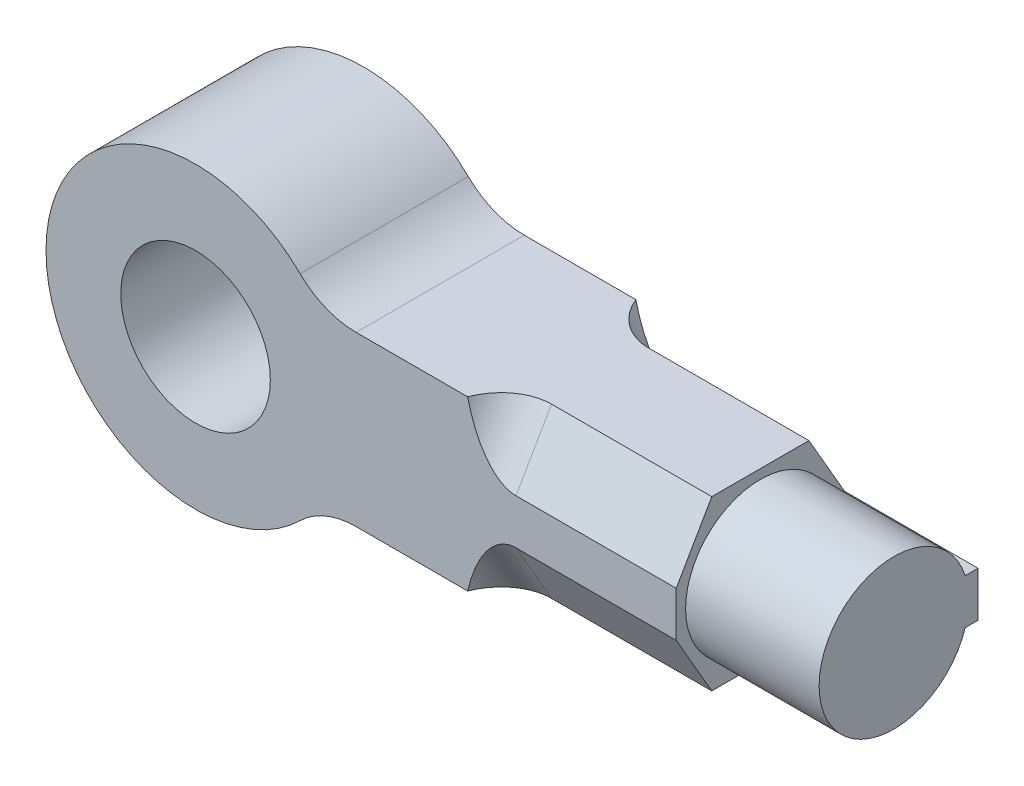
ISO-10303-21;
HEADER;
FILE_DESCRIPTION(('STEP AP214'),'2;1');
FILE_NAME('part.step','',(''),(''),'','','');
FILE_SCHEMA(('AUTOMOTIVE_DESIGN { 1 0 10303 214 1 1 1 1 }'));
ENDSEC;
DATA;
#1=APPLICATION_CONTEXT('core data for automotive mechanical design processes');
#2=APPLICATION_PROTOCOL_DEFINITION('international standard','automotive_design',2000,#1);
#3=PRODUCT_CONTEXT('',#1,'mechanical');
#4=PRODUCT('Part','Part','',(#3));
#5=PRODUCT_RELATED_PRODUCT_CATEGORY('part','',(#4));
#6=PRODUCT_DEFINITION_FORMATION('','',#4);
#7=PRODUCT_DEFINITION_CONTEXT('part definition',#1,'design');
#8=PRODUCT_DEFINITION('design','',#6,#7);
#9=PRODUCT_DEFINITION_SHAPE('','',#8);
#10=(LENGTH_UNIT() NAMED_UNIT(*) SI_UNIT(.MILLI.,.METRE.));
#11=(NAMED_UNIT(*) PLANE_ANGLE_UNIT() SI_UNIT($,.RADIAN.));
#12=(NAMED_UNIT(*) SI_UNIT($,.STERADIAN.) SOLID_ANGLE_UNIT());
#13=UNCERTAINTY_MEASURE_WITH_UNIT(LENGTH_MEASURE(1.E-05),#10,'distance_accuracy_value','');
#14=(GEOMETRIC_REPRESENTATION_CONTEXT(3) GLOBAL_UNCERTAINTY_ASSIGNED_CONTEXT((#13)) GLOBAL_UNIT_ASSIGNED_CONTEXT((#10,
#11,#12)) REPRESENTATION_CONTEXT('',''));
#15=CARTESIAN_POINT('',(0.,0.,0.));
#16=DIRECTION('',(0.,0.,1.));
#17=DIRECTION('',(1.,0.,0.));
#18=AXIS2_PLACEMENT_3D('',#15,#16,#17);
#19=CARTESIAN_POINT('',(180.,0.,0.));
#20=DIRECTION('',(1.,0.,0.));
#21=DIRECTION('',(0.,0.,-1.));
#22=AXIS2_PLACEMENT_3D('',#19,#20,#21);
#23=PLANE('',#22);
#24=CARTESIAN_POINT('',(180.,0.,0.));
#25=DIRECTION('',(1.,0.,0.));
#26=DIRECTION('',(0.,0.,-1.));
#27=AXIS2_PLACEMENT_3D('',#24,#25,#26);
#28=CIRCLE('',#27,28.);
#29=CARTESIAN_POINT('',(180.,8.44039956158089,-26.6975589753233));
#30=VERTEX_POINT('',#29);
#31=CARTESIAN_POINT('',(180.,-8.44039956158092,-26.6975589753233));
#32=VERTEX_POINT('',#31);
#33=EDGE_CURVE('E168',#30,#32,#28,.T.);
#34=ORIENTED_EDGE('',*,*,#33,.F.);
#35=DIRECTION('',(0.,0.,1.));
#36=VECTOR('',#35,1.);
#37=CARTESIAN_POINT('',(180.,8.44039956158089,-31.5));
#38=LINE('',#37,#36);
#39=CARTESIAN_POINT('',(180.,8.44039956158089,-31.5));
#40=VERTEX_POINT('',#39);
#41=EDGE_CURVE('E336',#40,#30,#38,.T.);
#42=ORIENTED_EDGE('',*,*,#41,.F.);
#43=DIRECTION('',(0.,0.866025403784439,0.5));
#44=VECTOR('',#43,1.);
#45=CARTESIAN_POINT('',(180.,0.,-36.3730669589467));
#46=LINE('',#45,#44);
#47=CARTESIAN_POINT('',(180.,31.5000000000003,-18.1865334794734));
#48=VERTEX_POINT('',#47);
#49=EDGE_CURVE('E269',#40,#48,#46,.T.);
#50=ORIENTED_EDGE('',*,*,#49,.T.);
#51=DIRECTION('',(0.,0.,1.));
#52=VECTOR('',#51,1.);
#53=CARTESIAN_POINT('',(180.,31.5,-31.5));
#54=LINE('',#53,#52);
#55=CARTESIAN_POINT('',(180.,31.5,18.1865334794735));
#56=VERTEX_POINT('',#55);
#57=EDGE_CURVE('E188',#48,#56,#54,.T.);
#58=ORIENTED_EDGE('',*,*,#57,.T.);
#59=DIRECTION('',(0.,-0.866025403784439,0.5));
#60=VECTOR('',#59,1.);
#61=CARTESIAN_POINT('',(180.,31.5000000000003,18.1865334794734));
#62=LINE('',#61,#60);
#63=CARTESIAN_POINT('',(180.,8.44039956158091,31.5));
#64=VERTEX_POINT('',#63);
#65=EDGE_CURVE('E293',#56,#64,#62,.T.);
#66=ORIENTED_EDGE('',*,*,#65,.T.);
#67=DIRECTION('',(0.,-1.,0.));
#68=VECTOR('',#67,1.);
#69=CARTESIAN_POINT('',(180.,-31.5,31.5));
#70=LINE('',#69,#68);
#71=CARTESIAN_POINT('',(180.,-8.44039956158091,31.5));
#72=VERTEX_POINT('',#71);
#73=EDGE_CURVE('E184',#64,#72,#70,.T.);
#74=ORIENTED_EDGE('',*,*,#73,.T.);
#75=DIRECTION('',(0.,-0.866025403784439,-0.5));
#76=VECTOR('',#75,1.);
#77=CARTESIAN_POINT('',(180.,0.,36.3730669589467));
#78=LINE('',#77,#76);
#79=CARTESIAN_POINT('',(180.,-31.5,18.1865334794735));
#80=VERTEX_POINT('',#79);
#81=EDGE_CURVE('E300',#72,#80,#78,.T.);
#82=ORIENTED_EDGE('',*,*,#81,.T.);
#83=DIRECTION('',(0.,0.,-1.));
#84=VECTOR('',#83,1.);
#85=CARTESIAN_POINT('',(180.,-31.5,-31.5));
#86=LINE('',#85,#84);
#87=CARTESIAN_POINT('',(180.,-31.5000000000003,-18.1865334794734));
#88=VERTEX_POINT('',#87);
#89=EDGE_CURVE('E189',#80,#88,#86,.T.);
#90=ORIENTED_EDGE('',*,*,#89,.T.);
#91=DIRECTION('',(0.,0.866025403784439,-0.5));
#92=VECTOR('',#91,1.);
#93=CARTESIAN_POINT('',(180.,-31.5000000000003,-18.1865334794734));
#94=LINE('',#93,#92);
#95=CARTESIAN_POINT('',(180.,-8.4403995615809,-31.5));
#96=VERTEX_POINT('',#95);
#97=EDGE_CURVE('E287',#88,#96,#94,.T.);
#98=ORIENTED_EDGE('',*,*,#97,.T.);
#99=DIRECTION('',(0.,0.,-1.));
#100=VECTOR('',#99,1.);
#101=CARTESIAN_POINT('',(180.,-8.4403995615809,-31.5));
#102=LINE('',#101,#100);
#103=EDGE_CURVE('E159',#32,#96,#102,.T.);
#104=ORIENTED_EDGE('',*,*,#103,.F.);
#105=EDGE_LOOP('',(#34,#42,#50,#58,#66,#74,#82,#90,#98,#104));
#106=FACE_BOUND('',#105,.T.);
#107=ADVANCED_FACE('F32',(#106),#23,.T.);
#108=CARTESIAN_POINT('',(230.,0.,0.));
#109=DIRECTION('',(-1.,0.,0.));
#110=DIRECTION('',(0.,0.,1.));
#111=AXIS2_PLACEMENT_3D('',#108,#109,#110);
#112=CYLINDRICAL_SURFACE('',#111,28.);
#113=DIRECTION('',(-1.,0.,0.));
#114=VECTOR('',#113,1.);
#115=CARTESIAN_POINT('',(247.550635852642,8.44039956158089,-26.6975589753233));
#116=LINE('',#115,#114);
#117=CARTESIAN_POINT('',(230.,8.44039956158088,-26.6975589753233));
#118=VERTEX_POINT('',#117);
#119=EDGE_CURVE('E169',#118,#30,#116,.T.);
#120=ORIENTED_EDGE('',*,*,#119,.T.);
#121=ORIENTED_EDGE('',*,*,#33,.T.);
#122=DIRECTION('',(-1.,0.,0.));
#123=VECTOR('',#122,1.);
#124=CARTESIAN_POINT('',(247.550635852642,-8.44039956158092,-26.6975589753233));
#125=LINE('',#124,#123);
#126=CARTESIAN_POINT('',(230.,-8.44039956158092,-26.6975589753233));
#127=VERTEX_POINT('',#126);
#128=EDGE_CURVE('E154',#127,#32,#125,.T.);
#129=ORIENTED_EDGE('',*,*,#128,.F.);
#130=CARTESIAN_POINT('',(230.,0.,0.));
#131=DIRECTION('',(1.,0.,0.));
#132=DIRECTION('',(0.,0.,-1.));
#133=AXIS2_PLACEMENT_3D('',#130,#131,#132);
#134=CIRCLE('',#133,28.);
#135=EDGE_CURVE('E166',#118,#127,#134,.T.);
#136=ORIENTED_EDGE('',*,*,#135,.F.);
#137=EDGE_LOOP('',(#120,#121,#129,#136));
#138=FACE_BOUND('',#137,.T.);
#139=ADVANCED_FACE('F165',(#138),#112,.T.);
#140=CARTESIAN_POINT('',(0.,0.,31.5));
#141=DIRECTION('',(0.,0.,1.));
#142=DIRECTION('',(1.,0.,0.));
#143=AXIS2_PLACEMENT_3D('',#140,#141,#142);
#144=PLANE('',#143);
#145=CARTESIAN_POINT('',(0.,0.,31.5));
#146=DIRECTION('',(0.,0.,1.));
#147=DIRECTION('',(1.,0.,0.));
#148=AXIS2_PLACEMENT_3D('',#145,#146,#147);
#149=CIRCLE('',#148,28.);
#150=CARTESIAN_POINT('',(28.,0.,31.5));
#151=VERTEX_POINT('',#150);
#152=EDGE_CURVE('E198',#151,#151,#149,.T.);
#153=ORIENTED_EDGE('',*,*,#152,.F.);
#154=EDGE_LOOP('',(#153));
#155=FACE_BOUND('',#154,.T.);
#156=DIRECTION('',(1.,0.,0.));
#157=VECTOR('',#156,1.);
#158=CARTESIAN_POINT('',(-56.002,-31.5,31.5));
#159=LINE('',#158,#157);
#160=CARTESIAN_POINT('',(60.1144741306118,-31.5,31.5));
#161=VERTEX_POINT('',#160);
#162=CARTESIAN_POINT('',(101.882171331158,-31.5,31.5));
#163=VERTEX_POINT('',#162);
#164=EDGE_CURVE('E172',#161,#163,#159,.T.);
#165=ORIENTED_EDGE('',*,*,#164,.T.);
#166=CARTESIAN_POINT('',(120.,-48.4403995615809,31.5));
#167=DIRECTION('',(0.,0.,1.));
#168=DIRECTION('',(0.,1.,0.));
#169=AXIS2_PLACEMENT_3D('',#166,#167,#168);
#170=ELLIPSE('',#169,40.,20.);
#171=CARTESIAN_POINT('',(120.,-8.44039956158091,31.5));
#172=VERTEX_POINT('',#171);
#173=EDGE_CURVE('E245',#163,#172,#170,.F.);
#174=ORIENTED_EDGE('',*,*,#173,.T.);
#175=DIRECTION('',(1.,0.,0.));
#176=VECTOR('',#175,1.);
#177=CARTESIAN_POINT('',(0.,-8.44039956158091,31.5));
#178=LINE('',#177,#176);
#179=EDGE_CURVE('E173',#172,#72,#178,.T.);
#180=ORIENTED_EDGE('',*,*,#179,.T.);
#181=ORIENTED_EDGE('',*,*,#73,.F.);
#182=DIRECTION('',(-1.,0.,0.));
#183=VECTOR('',#182,1.);
#184=CARTESIAN_POINT('',(0.,8.44039956158091,31.5));
#185=LINE('',#184,#183);
#186=CARTESIAN_POINT('',(120.,8.44039956158091,31.5));
#187=VERTEX_POINT('',#186);
#188=EDGE_CURVE('E270',#64,#187,#185,.T.);
#189=ORIENTED_EDGE('',*,*,#188,.T.);
#190=CARTESIAN_POINT('',(120.,48.4403995615809,31.5));
#191=DIRECTION('',(0.,0.,1.));
#192=DIRECTION('',(0.,1.,0.));
#193=AXIS2_PLACEMENT_3D('',#190,#191,#192);
#194=ELLIPSE('',#193,40.,20.);
#195=CARTESIAN_POINT('',(101.882171331158,31.5,31.5));
#196=VERTEX_POINT('',#195);
#197=EDGE_CURVE('E237',#187,#196,#194,.F.);
#198=ORIENTED_EDGE('',*,*,#197,.T.);
#199=DIRECTION('',(1.,0.,0.));
#200=VECTOR('',#199,1.);
#201=CARTESIAN_POINT('',(-56.002,31.5,31.5));
#202=LINE('',#201,#200);
#203=CARTESIAN_POINT('',(60.1144741306118,31.5,31.5));
#204=VERTEX_POINT('',#203);
#205=EDGE_CURVE('E192',#204,#196,#202,.T.);
#206=ORIENTED_EDGE('',*,*,#205,.F.);
#207=CARTESIAN_POINT('',(60.1144741306118,61.5,31.5));
#208=DIRECTION('',(0.,0.,1.));
#209=DIRECTION('',(1.,0.,0.));
#210=AXIS2_PLACEMENT_3D('',#207,#208,#209);
#211=CIRCLE('',#210,30.);
#212=CARTESIAN_POINT('',(39.1443087362124,40.046511627907,31.5));
#213=VERTEX_POINT('',#212);
#214=EDGE_CURVE('E223',#204,#213,#211,.F.);
#215=ORIENTED_EDGE('',*,*,#214,.T.);
#216=CARTESIAN_POINT('',(0.,0.,31.5));
#217=DIRECTION('',(0.,0.,1.));
#218=DIRECTION('',(1.,0.,0.));
#219=AXIS2_PLACEMENT_3D('',#216,#217,#218);
#220=CIRCLE('',#219,56.);
#221=CARTESIAN_POINT('',(39.1443087362124,-40.046511627907,31.5));
#222=VERTEX_POINT('',#221);
#223=EDGE_CURVE('E204',#213,#222,#220,.T.);
#224=ORIENTED_EDGE('',*,*,#223,.T.);
#225=CARTESIAN_POINT('',(60.1144741306118,-61.5,31.5));
#226=DIRECTION('',(0.,0.,1.));
#227=DIRECTION('',(1.,0.,0.));
#228=AXIS2_PLACEMENT_3D('',#225,#226,#227);
#229=CIRCLE('',#228,30.);
#230=EDGE_CURVE('E221',#222,#161,#229,.F.);
#231=ORIENTED_EDGE('',*,*,#230,.T.);
#232=EDGE_LOOP('',(#165,#174,#180,#181,#189,#198,#206,#215,#224,#231));
#233=FACE_BOUND('',#232,.T.);
#234=ADVANCED_FACE('F321',(#155,#233),#144,.T.);
#235=CARTESIAN_POINT('',(0.,0.,-31.5));
#236=DIRECTION('',(0.,0.,1.));
#237=DIRECTION('',(1.,0.,0.));
#238=AXIS2_PLACEMENT_3D('',#235,#236,#237);
#239=PLANE('',#238);
#240=CARTESIAN_POINT('',(0.,0.,-31.5));
#241=DIRECTION('',(0.,0.,1.));
#242=DIRECTION('',(1.,0.,0.));
#243=AXIS2_PLACEMENT_3D('',#240,#241,#242);
#244=CIRCLE('',#243,28.);
#245=CARTESIAN_POINT('',(28.,0.,-31.5));
#246=VERTEX_POINT('',#245);
#247=EDGE_CURVE('E187',#246,#246,#244,.T.);
#248=ORIENTED_EDGE('',*,*,#247,.T.);
#249=EDGE_LOOP('',(#248));
#250=FACE_BOUND('',#249,.T.);
#251=DIRECTION('',(1.,0.,0.));
#252=VECTOR('',#251,1.);
#253=CARTESIAN_POINT('',(-56.002,31.5,-31.5));
#254=LINE('',#253,#252);
#255=CARTESIAN_POINT('',(60.1144741306118,31.5,-31.5));
#256=VERTEX_POINT('',#255);
#257=CARTESIAN_POINT('',(101.882171331158,31.5,-31.5));
#258=VERTEX_POINT('',#257);
#259=EDGE_CURVE('E54',#256,#258,#254,.T.);
#260=ORIENTED_EDGE('',*,*,#259,.T.);
#261=CARTESIAN_POINT('',(120.,48.4403995615809,-31.5));
#262=DIRECTION('',(0.,0.,1.));
#263=DIRECTION('',(0.,-1.,0.));
#264=AXIS2_PLACEMENT_3D('',#261,#262,#263);
#265=ELLIPSE('',#264,40.,20.);
#266=CARTESIAN_POINT('',(120.,8.4403995615809,-31.5));
#267=VERTEX_POINT('',#266);
#268=EDGE_CURVE('E11',#258,#267,#265,.T.);
#269=ORIENTED_EDGE('',*,*,#268,.T.);
#270=DIRECTION('',(-1.,0.,0.));
#271=VECTOR('',#270,1.);
#272=CARTESIAN_POINT('',(0.,8.4403995615809,-31.5));
#273=LINE('',#272,#271);
#274=EDGE_CURVE('E264',#40,#267,#273,.T.);
#275=ORIENTED_EDGE('',*,*,#274,.F.);
#276=DIRECTION('',(-1.,0.,0.));
#277=VECTOR('',#276,1.);
#278=CARTESIAN_POINT('',(247.550635852642,8.44039956158089,-31.5));
#279=LINE('',#278,#277);
#280=CARTESIAN_POINT('',(230.,8.44039956158089,-31.5));
#281=VERTEX_POINT('',#280);
#282=EDGE_CURVE('E338',#281,#40,#279,.T.);
#283=ORIENTED_EDGE('',*,*,#282,.F.);
#284=DIRECTION('',(0.,1.,0.));
#285=VECTOR('',#284,1.);
#286=CARTESIAN_POINT('',(230.,8.44039956158089,-31.5));
#287=LINE('',#286,#285);
#288=CARTESIAN_POINT('',(230.,-8.4403995615809,-31.5));
#289=VERTEX_POINT('',#288);
#290=EDGE_CURVE('E158',#289,#281,#287,.T.);
#291=ORIENTED_EDGE('',*,*,#290,.F.);
#292=DIRECTION('',(-1.,0.,0.));
#293=VECTOR('',#292,1.);
#294=CARTESIAN_POINT('',(247.550635852642,-8.4403995615809,-31.5));
#295=LINE('',#294,#293);
#296=EDGE_CURVE('E156',#289,#96,#295,.T.);
#297=ORIENTED_EDGE('',*,*,#296,.T.);
#298=DIRECTION('',(1.,0.,0.));
#299=VECTOR('',#298,1.);
#300=CARTESIAN_POINT('',(0.,-8.4403995615809,-31.5));
#301=LINE('',#300,#299);
#302=CARTESIAN_POINT('',(120.,-8.4403995615809,-31.5));
#303=VERTEX_POINT('',#302);
#304=EDGE_CURVE('E177',#303,#96,#301,.T.);
#305=ORIENTED_EDGE('',*,*,#304,.F.);
#306=CARTESIAN_POINT('',(120.,-48.4403995615809,-31.5));
#307=DIRECTION('',(0.,0.,1.));
#308=DIRECTION('',(0.,-1.,0.));
#309=AXIS2_PLACEMENT_3D('',#306,#307,#308);
#310=ELLIPSE('',#309,40.,20.);
#311=CARTESIAN_POINT('',(101.882171331158,-31.5,-31.5));
#312=VERTEX_POINT('',#311);
#313=EDGE_CURVE('E247',#303,#312,#310,.T.);
#314=ORIENTED_EDGE('',*,*,#313,.T.);
#315=DIRECTION('',(1.,0.,0.));
#316=VECTOR('',#315,1.);
#317=CARTESIAN_POINT('',(-56.002,-31.5,-31.5));
#318=LINE('',#317,#316);
#319=CARTESIAN_POINT('',(60.1144741306118,-31.5,-31.5));
#320=VERTEX_POINT('',#319);
#321=EDGE_CURVE('E175',#320,#312,#318,.T.);
#322=ORIENTED_EDGE('',*,*,#321,.F.);
#323=CARTESIAN_POINT('',(60.1144741306118,-61.5,-31.5));
#324=DIRECTION('',(0.,0.,1.));
#325=DIRECTION('',(1.,0.,0.));
#326=AXIS2_PLACEMENT_3D('',#323,#324,#325);
#327=CIRCLE('',#326,30.);
#328=CARTESIAN_POINT('',(39.1443087362124,-40.046511627907,-31.5));
#329=VERTEX_POINT('',#328);
#330=EDGE_CURVE('E219',#320,#329,#327,.T.);
#331=ORIENTED_EDGE('',*,*,#330,.T.);
#332=CARTESIAN_POINT('',(0.,0.,-31.5));
#333=DIRECTION('',(0.,0.,1.));
#334=DIRECTION('',(1.,0.,0.));
#335=AXIS2_PLACEMENT_3D('',#332,#333,#334);
#336=CIRCLE('',#335,56.);
#337=CARTESIAN_POINT('',(39.1443087362124,40.046511627907,-31.5));
#338=VERTEX_POINT('',#337);
#339=EDGE_CURVE('E201',#338,#329,#336,.T.);
#340=ORIENTED_EDGE('',*,*,#339,.F.);
#341=CARTESIAN_POINT('',(60.1144741306118,61.5,-31.5));
#342=DIRECTION('',(0.,0.,1.));
#343=DIRECTION('',(1.,0.,0.));
#344=AXIS2_PLACEMENT_3D('',#341,#342,#343);
#345=CIRCLE('',#344,30.);
#346=EDGE_CURVE('E183',#338,#256,#345,.T.);
#347=ORIENTED_EDGE('',*,*,#346,.T.);
#348=EDGE_LOOP('',(#260,#269,#275,#283,#291,#297,#305,#314,#322,#331,#340,#347));
#349=FACE_BOUND('',#348,.T.);
#350=ADVANCED_FACE('F262',(#250,#349),#239,.F.);
#351=CARTESIAN_POINT('',(-56.002,-31.5,-31.5));
#352=DIRECTION('',(0.,-1.,0.));
#353=DIRECTION('',(0.,0.,-1.));
#354=AXIS2_PLACEMENT_3D('',#351,#352,#353);
#355=PLANE('',#354);
#356=ORIENTED_EDGE('',*,*,#89,.F.);
#357=DIRECTION('',(1.,0.,0.));
#358=VECTOR('',#357,1.);
#359=CARTESIAN_POINT('',(100.,-31.5000000000003,18.1865334794734));
#360=LINE('',#359,#358);
#361=CARTESIAN_POINT('',(120.,-31.5000000000003,18.1865334794734));
#362=VERTEX_POINT('',#361);
#363=EDGE_CURVE('E271',#362,#80,#360,.T.);
#364=ORIENTED_EDGE('',*,*,#363,.F.);
#365=CARTESIAN_POINT('',(120.,-31.5,41.2805442470586));
#366=DIRECTION('',(0.,-1.,0.));
#367=DIRECTION('',(0.,0.,1.));
#368=AXIS2_PLACEMENT_3D('',#365,#366,#367);
#369=ELLIPSE('',#368,23.094010767585,20.);
#370=EDGE_CURVE('E242',#362,#163,#369,.F.);
#371=ORIENTED_EDGE('',*,*,#370,.T.);
#372=ORIENTED_EDGE('',*,*,#164,.F.);
#373=DIRECTION('',(0.,0.,-1.));
#374=VECTOR('',#373,1.);
#375=CARTESIAN_POINT('',(60.1144741306118,-31.5,-31.5));
#376=LINE('',#375,#374);
#377=EDGE_CURVE('E207',#161,#320,#376,.T.);
#378=ORIENTED_EDGE('',*,*,#377,.T.);
#379=ORIENTED_EDGE('',*,*,#321,.T.);
#380=CARTESIAN_POINT('',(120.,-31.5,-41.2805442470585));
#381=DIRECTION('',(0.,-1.,0.));
#382=DIRECTION('',(0.,0.,1.));
#383=AXIS2_PLACEMENT_3D('',#380,#381,#382);
#384=ELLIPSE('',#383,23.094010767585,20.);
#385=CARTESIAN_POINT('',(120.,-31.5000000000003,-18.1865334794734));
#386=VERTEX_POINT('',#385);
#387=EDGE_CURVE('E250',#312,#386,#384,.F.);
#388=ORIENTED_EDGE('',*,*,#387,.T.);
#389=DIRECTION('',(1.,0.,0.));
#390=VECTOR('',#389,1.);
#391=CARTESIAN_POINT('',(100.,-31.5000000000003,-18.1865334794734));
#392=LINE('',#391,#390);
#393=EDGE_CURVE('E278',#386,#88,#392,.T.);
#394=ORIENTED_EDGE('',*,*,#393,.T.);
#395=EDGE_LOOP('',(#356,#364,#371,#372,#378,#379,#388,#394));
#396=FACE_BOUND('',#395,.T.);
#397=ADVANCED_FACE('F303',(#396),#355,.T.);
#398=CARTESIAN_POINT('',(-56.002,31.5,-31.5));
#399=DIRECTION('',(0.,1.,0.));
#400=DIRECTION('',(0.,0.,1.));
#401=AXIS2_PLACEMENT_3D('',#398,#399,#400);
#402=PLANE('',#401);
#403=DIRECTION('',(1.,0.,0.));
#404=VECTOR('',#403,1.);
#405=CARTESIAN_POINT('',(100.,31.5000000000003,-18.1865334794734));
#406=LINE('',#405,#404);
#407=CARTESIAN_POINT('',(120.,31.5000000000003,-18.1865334794734));
#408=VERTEX_POINT('',#407);
#409=EDGE_CURVE('E257',#408,#48,#406,.T.);
#410=ORIENTED_EDGE('',*,*,#409,.F.);
#411=CARTESIAN_POINT('',(120.,31.5,-41.2805442470586));
#412=DIRECTION('',(0.,1.,0.));
#413=DIRECTION('',(0.,0.,-1.));
#414=AXIS2_PLACEMENT_3D('',#411,#412,#413);
#415=ELLIPSE('',#414,23.094010767585,20.);
#416=EDGE_CURVE('E40',#408,#258,#415,.F.);
#417=ORIENTED_EDGE('',*,*,#416,.T.);
#418=ORIENTED_EDGE('',*,*,#259,.F.);
#419=DIRECTION('',(0.,0.,-1.));
#420=VECTOR('',#419,1.);
#421=CARTESIAN_POINT('',(60.1144741306118,31.5,-31.5));
#422=LINE('',#421,#420);
#423=EDGE_CURVE('E216',#256,#204,#422,.F.);
#424=ORIENTED_EDGE('',*,*,#423,.T.);
#425=ORIENTED_EDGE('',*,*,#205,.T.);
#426=CARTESIAN_POINT('',(120.,31.5,41.2805442470586));
#427=DIRECTION('',(0.,1.,0.));
#428=DIRECTION('',(0.,0.,-1.));
#429=AXIS2_PLACEMENT_3D('',#426,#427,#428);
#430=ELLIPSE('',#429,23.094010767585,20.);
#431=CARTESIAN_POINT('',(120.,31.5000000000003,18.1865334794734));
#432=VERTEX_POINT('',#431);
#433=EDGE_CURVE('E240',#196,#432,#430,.F.);
#434=ORIENTED_EDGE('',*,*,#433,.T.);
#435=DIRECTION('',(1.,0.,0.));
#436=VECTOR('',#435,1.);
#437=CARTESIAN_POINT('',(100.,31.5000000000003,18.1865334794734));
#438=LINE('',#437,#436);
#439=EDGE_CURVE('E275',#432,#56,#438,.T.);
#440=ORIENTED_EDGE('',*,*,#439,.T.);
#441=ORIENTED_EDGE('',*,*,#57,.F.);
#442=EDGE_LOOP('',(#410,#417,#418,#424,#425,#434,#440,#441));
#443=FACE_BOUND('',#442,.T.);
#444=ADVANCED_FACE('F254',(#443),#402,.T.);
#445=CARTESIAN_POINT('',(0.,0.,31.5));
#446=DIRECTION('',(0.,0.,-1.));
#447=DIRECTION('',(-1.,0.,0.));
#448=AXIS2_PLACEMENT_3D('',#445,#446,#447);
#449=CYLINDRICAL_SURFACE('',#448,56.);
#450=ORIENTED_EDGE('',*,*,#339,.T.);
#451=DIRECTION('',(0.,0.,-1.));
#452=VECTOR('',#451,1.);
#453=CARTESIAN_POINT('',(39.1443087362124,-40.046511627907,31.5));
#454=LINE('',#453,#452);
#455=EDGE_CURVE('E214',#329,#222,#454,.F.);
#456=ORIENTED_EDGE('',*,*,#455,.T.);
#457=ORIENTED_EDGE('',*,*,#223,.F.);
#458=DIRECTION('',(0.,0.,-1.));
#459=VECTOR('',#458,1.);
#460=CARTESIAN_POINT('',(39.1443087362124,40.046511627907,31.5));
#461=LINE('',#460,#459);
#462=EDGE_CURVE('E212',#213,#338,#461,.T.);
#463=ORIENTED_EDGE('',*,*,#462,.T.);
#464=EDGE_LOOP('',(#450,#456,#457,#463));
#465=FACE_BOUND('',#464,.T.);
#466=ADVANCED_FACE('F318',(#465),#449,.T.);
#467=CARTESIAN_POINT('',(0.,0.,31.5));
#468=DIRECTION('',(0.,0.,-1.));
#469=DIRECTION('',(-1.,0.,0.));
#470=AXIS2_PLACEMENT_3D('',#467,#468,#469);
#471=CYLINDRICAL_SURFACE('',#470,28.);
#472=ORIENTED_EDGE('',*,*,#152,.T.);
#473=EDGE_LOOP('',(#472));
#474=FACE_BOUND('',#473,.T.);
#475=ORIENTED_EDGE('',*,*,#247,.F.);
#476=EDGE_LOOP('',(#475));
#477=FACE_BOUND('',#476,.T.);
#478=ADVANCED_FACE('F365',(#474,#477),#471,.F.);
#479=CARTESIAN_POINT('',(60.1144741306118,-61.5,31.5));
#480=DIRECTION('',(0.,0.,-1.));
#481=DIRECTION('',(-1.,0.,0.));
#482=AXIS2_PLACEMENT_3D('',#479,#480,#481);
#483=CYLINDRICAL_SURFACE('',#482,30.);
#484=ORIENTED_EDGE('',*,*,#230,.F.);
#485=ORIENTED_EDGE('',*,*,#455,.F.);
#486=ORIENTED_EDGE('',*,*,#330,.F.);
#487=ORIENTED_EDGE('',*,*,#377,.F.);
#488=EDGE_LOOP('',(#484,#485,#486,#487));
#489=FACE_BOUND('',#488,.T.);
#490=ADVANCED_FACE('F314',(#489),#483,.F.);
#491=CARTESIAN_POINT('',(60.1144741306118,61.5,31.5));
#492=DIRECTION('',(0.,0.,-1.));
#493=DIRECTION('',(-1.,0.,0.));
#494=AXIS2_PLACEMENT_3D('',#491,#492,#493);
#495=CYLINDRICAL_SURFACE('',#494,30.);
#496=ORIENTED_EDGE('',*,*,#346,.F.);
#497=ORIENTED_EDGE('',*,*,#462,.F.);
#498=ORIENTED_EDGE('',*,*,#214,.F.);
#499=ORIENTED_EDGE('',*,*,#423,.F.);
#500=EDGE_LOOP('',(#496,#497,#498,#499));
#501=FACE_BOUND('',#500,.T.);
#502=ADVANCED_FACE('F325',(#501),#495,.F.);
#503=CARTESIAN_POINT('',(230.,0.,0.));
#504=DIRECTION('',(1.,0.,0.));
#505=DIRECTION('',(0.,0.,-1.));
#506=AXIS2_PLACEMENT_3D('',#503,#504,#505);
#507=PLANE('',#506);
#508=ORIENTED_EDGE('',*,*,#135,.T.);
#509=DIRECTION('',(0.,0.,-1.));
#510=VECTOR('',#509,1.);
#511=CARTESIAN_POINT('',(230.,-8.4403995615809,-31.5));
#512=LINE('',#511,#510);
#513=EDGE_CURVE('E150',#127,#289,#512,.T.);
#514=ORIENTED_EDGE('',*,*,#513,.T.);
#515=ORIENTED_EDGE('',*,*,#290,.T.);
#516=DIRECTION('',(0.,0.,1.));
#517=VECTOR('',#516,1.);
#518=CARTESIAN_POINT('',(230.,8.44039956158089,-31.5));
#519=LINE('',#518,#517);
#520=EDGE_CURVE('E47',#281,#118,#519,.T.);
#521=ORIENTED_EDGE('',*,*,#520,.T.);
#522=EDGE_LOOP('',(#508,#514,#515,#521));
#523=FACE_BOUND('',#522,.T.);
#524=ADVANCED_FACE('F171',(#523),#507,.T.);
#525=CARTESIAN_POINT('',(100.,0.,-36.3730669589467));
#526=DIRECTION('',(0.,0.5,-0.866025403784439));
#527=DIRECTION('',(0.,0.866025403784439,0.5));
#528=AXIS2_PLACEMENT_3D('',#525,#526,#527);
#529=PLANE('',#528);
#530=ORIENTED_EDGE('',*,*,#274,.T.);
#531=DIRECTION('',(0.,0.866025403784439,0.5));
#532=VECTOR('',#531,1.);
#533=CARTESIAN_POINT('',(120.,31.5,-18.1865334794735));
#534=LINE('',#533,#532);
#535=EDGE_CURVE('E234',#267,#408,#534,.T.);
#536=ORIENTED_EDGE('',*,*,#535,.T.);
#537=ORIENTED_EDGE('',*,*,#409,.T.);
#538=ORIENTED_EDGE('',*,*,#49,.F.);
#539=EDGE_LOOP('',(#530,#536,#537,#538));
#540=FACE_BOUND('',#539,.T.);
#541=ADVANCED_FACE('F267',(#540),#529,.T.);
#542=CARTESIAN_POINT('',(100.,31.5000000000003,18.1865334794734));
#543=DIRECTION('',(0.,0.5,0.866025403784439));
#544=DIRECTION('',(0.,-0.866025403784439,0.5));
#545=AXIS2_PLACEMENT_3D('',#542,#543,#544);
#546=PLANE('',#545);
#547=ORIENTED_EDGE('',*,*,#439,.F.);
#548=DIRECTION('',(0.,-0.866025403784439,0.5));
#549=VECTOR('',#548,1.);
#550=CARTESIAN_POINT('',(120.,8.44039956158091,31.5));
#551=LINE('',#550,#549);
#552=EDGE_CURVE('E182',#432,#187,#551,.T.);
#553=ORIENTED_EDGE('',*,*,#552,.T.);
#554=ORIENTED_EDGE('',*,*,#188,.F.);
#555=ORIENTED_EDGE('',*,*,#65,.F.);
#556=EDGE_LOOP('',(#547,#553,#554,#555));
#557=FACE_BOUND('',#556,.T.);
#558=ADVANCED_FACE('F333',(#557),#546,.T.);
#559=CARTESIAN_POINT('',(100.,-31.5000000000003,-18.1865334794734));
#560=DIRECTION('',(0.,-0.5,-0.866025403784439));
#561=DIRECTION('',(0.,0.866025403784439,-0.5));
#562=AXIS2_PLACEMENT_3D('',#559,#560,#561);
#563=PLANE('',#562);
#564=ORIENTED_EDGE('',*,*,#393,.F.);
#565=DIRECTION('',(0.,0.866025403784439,-0.5));
#566=VECTOR('',#565,1.);
#567=CARTESIAN_POINT('',(120.,-8.44039956158089,-31.5));
#568=LINE('',#567,#566);
#569=EDGE_CURVE('E231',#386,#303,#568,.T.);
#570=ORIENTED_EDGE('',*,*,#569,.T.);
#571=ORIENTED_EDGE('',*,*,#304,.T.);
#572=ORIENTED_EDGE('',*,*,#97,.F.);
#573=EDGE_LOOP('',(#564,#570,#571,#572));
#574=FACE_BOUND('',#573,.T.);
#575=ADVANCED_FACE('F286',(#574),#563,.T.);
#576=CARTESIAN_POINT('',(100.,0.,36.3730669589467));
#577=DIRECTION('',(0.,-0.5,0.866025403784439));
#578=DIRECTION('',(0.,-0.866025403784439,-0.5));
#579=AXIS2_PLACEMENT_3D('',#576,#577,#578);
#580=PLANE('',#579);
#581=ORIENTED_EDGE('',*,*,#179,.F.);
#582=DIRECTION('',(0.,-0.866025403784439,-0.5));
#583=VECTOR('',#582,1.);
#584=CARTESIAN_POINT('',(120.,-31.5000000000003,18.1865334794734));
#585=LINE('',#584,#583);
#586=EDGE_CURVE('E228',#172,#362,#585,.T.);
#587=ORIENTED_EDGE('',*,*,#586,.T.);
#588=ORIENTED_EDGE('',*,*,#363,.T.);
#589=ORIENTED_EDGE('',*,*,#81,.F.);
#590=EDGE_LOOP('',(#581,#587,#588,#589));
#591=FACE_BOUND('',#590,.T.);
#592=ADVANCED_FACE('F384',(#591),#580,.T.);
#593=CARTESIAN_POINT('',(120.,41.5000000000003,35.5070415551621));
#594=DIRECTION('',(0.,0.866025403784439,-0.5));
#595=DIRECTION('',(0.,0.5,0.866025403784439));
#596=AXIS2_PLACEMENT_3D('',#593,#594,#595);
#597=CYLINDRICAL_SURFACE('',#596,20.);
#598=ORIENTED_EDGE('',*,*,#433,.F.);
#599=ORIENTED_EDGE('',*,*,#197,.F.);
#600=ORIENTED_EDGE('',*,*,#552,.F.);
#601=EDGE_LOOP('',(#598,#599,#600));
#602=FACE_BOUND('',#601,.T.);
#603=ADVANCED_FACE('F331',(#602),#597,.F.);
#604=CARTESIAN_POINT('',(120.,-10.,53.6935750346355));
#605=DIRECTION('',(0.,0.866025403784439,0.5));
#606=DIRECTION('',(0.,-0.5,0.866025403784439));
#607=AXIS2_PLACEMENT_3D('',#604,#605,#606);
#608=CYLINDRICAL_SURFACE('',#607,20.);
#609=ORIENTED_EDGE('',*,*,#586,.F.);
#610=ORIENTED_EDGE('',*,*,#173,.F.);
#611=ORIENTED_EDGE('',*,*,#370,.F.);
#612=EDGE_LOOP('',(#609,#610,#611));
#613=FACE_BOUND('',#612,.T.);
#614=ADVANCED_FACE('F383',(#613),#608,.F.);
#615=CARTESIAN_POINT('',(120.,-41.5000000000003,-35.5070415551621));
#616=DIRECTION('',(0.,-0.866025403784439,0.5));
#617=DIRECTION('',(0.,-0.5,-0.866025403784439));
#618=AXIS2_PLACEMENT_3D('',#615,#616,#617);
#619=CYLINDRICAL_SURFACE('',#618,20.);
#620=ORIENTED_EDGE('',*,*,#387,.F.);
#621=ORIENTED_EDGE('',*,*,#313,.F.);
#622=ORIENTED_EDGE('',*,*,#569,.F.);
#623=EDGE_LOOP('',(#620,#621,#622));
#624=FACE_BOUND('',#623,.T.);
#625=ADVANCED_FACE('F307',(#624),#619,.F.);
#626=CARTESIAN_POINT('',(120.,10.,-53.6935750346355));
#627=DIRECTION('',(0.,-0.866025403784439,-0.5));
#628=DIRECTION('',(0.,0.5,-0.866025403784439));
#629=AXIS2_PLACEMENT_3D('',#626,#627,#628);
#630=CYLINDRICAL_SURFACE('',#629,20.);
#631=ORIENTED_EDGE('',*,*,#535,.F.);
#632=ORIENTED_EDGE('',*,*,#268,.F.);
#633=ORIENTED_EDGE('',*,*,#416,.F.);
#634=EDGE_LOOP('',(#631,#632,#633));
#635=FACE_BOUND('',#634,.T.);
#636=ADVANCED_FACE('F34',(#635),#630,.F.);
#637=CARTESIAN_POINT('',(247.550635852642,8.44039956158089,-31.5));
#638=DIRECTION('',(0.,-1.,0.));
#639=DIRECTION('',(0.,0.,-1.));
#640=AXIS2_PLACEMENT_3D('',#637,#638,#639);
#641=PLANE('',#640);
#642=ORIENTED_EDGE('',*,*,#520,.F.);
#643=ORIENTED_EDGE('',*,*,#282,.T.);
#644=ORIENTED_EDGE('',*,*,#41,.T.);
#645=ORIENTED_EDGE('',*,*,#119,.F.);
#646=EDGE_LOOP('',(#642,#643,#644,#645));
#647=FACE_BOUND('',#646,.T.);
#648=ADVANCED_FACE('F344',(#647),#641,.F.);
#649=CARTESIAN_POINT('',(247.550635852642,-8.4403995615809,-31.5));
#650=DIRECTION('',(0.,1.,0.));
#651=DIRECTION('',(0.,0.,1.));
#652=AXIS2_PLACEMENT_3D('',#649,#650,#651);
#653=PLANE('',#652);
#654=ORIENTED_EDGE('',*,*,#513,.F.);
#655=ORIENTED_EDGE('',*,*,#128,.T.);
#656=ORIENTED_EDGE('',*,*,#103,.T.);
#657=ORIENTED_EDGE('',*,*,#296,.F.);
#658=EDGE_LOOP('',(#654,#655,#656,#657));
#659=FACE_BOUND('',#658,.T.);
#660=ADVANCED_FACE('F152',(#659),#653,.F.);
#661=CLOSED_SHELL('',(#107,#139,#234,#350,#397,#444,#466,#478,#490,#502,#524,#541,#558,#575,
#592,#603,#614,#625,#636,#648,#660));
#662=MANIFOLD_SOLID_BREP('B2',#661);
#663=ADVANCED_BREP_SHAPE_REPRESENTATION('',(#18,#662),#14);
#664=SHAPE_DEFINITION_REPRESENTATION(#9,#663);
ENDSEC;
END-ISO-10303-21;
